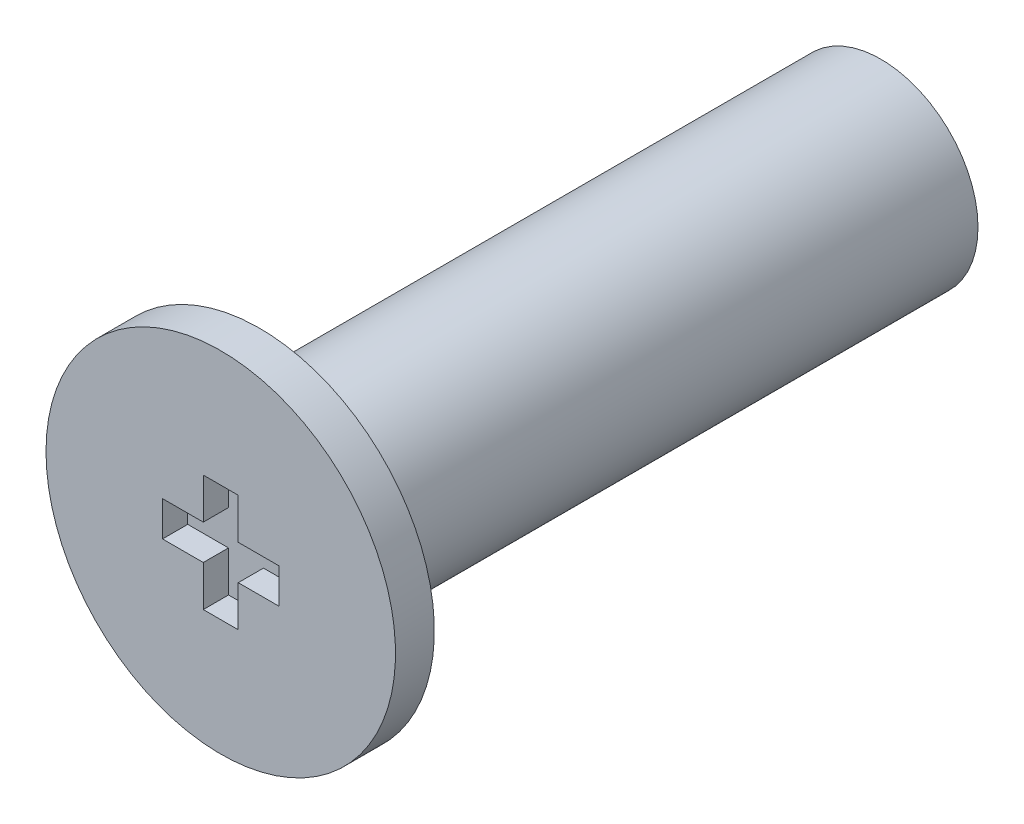
ISO-10303-21;
HEADER;
FILE_DESCRIPTION(('STEP AP214'),'2;1');
FILE_NAME('part.step','',(''),(''),'','','');
FILE_SCHEMA(('AUTOMOTIVE_DESIGN { 1 0 10303 214 1 1 1 1 }'));
ENDSEC;
DATA;
#1=APPLICATION_CONTEXT('core data for automotive mechanical design processes');
#2=APPLICATION_PROTOCOL_DEFINITION('international standard','automotive_design',2000,#1);
#3=PRODUCT_CONTEXT('',#1,'mechanical');
#4=PRODUCT('Part','Part','',(#3));
#5=PRODUCT_RELATED_PRODUCT_CATEGORY('part','',(#4));
#6=PRODUCT_DEFINITION_FORMATION('','',#4);
#7=PRODUCT_DEFINITION_CONTEXT('part definition',#1,'design');
#8=PRODUCT_DEFINITION('design','',#6,#7);
#9=PRODUCT_DEFINITION_SHAPE('','',#8);
#10=(LENGTH_UNIT() NAMED_UNIT(*) SI_UNIT(.MILLI.,.METRE.));
#11=(NAMED_UNIT(*) PLANE_ANGLE_UNIT() SI_UNIT($,.RADIAN.));
#12=(NAMED_UNIT(*) SI_UNIT($,.STERADIAN.) SOLID_ANGLE_UNIT());
#13=UNCERTAINTY_MEASURE_WITH_UNIT(LENGTH_MEASURE(1.E-05),#10,'distance_accuracy_value','');
#14=(GEOMETRIC_REPRESENTATION_CONTEXT(3) GLOBAL_UNCERTAINTY_ASSIGNED_CONTEXT((#13)) GLOBAL_UNIT_ASSIGNED_CONTEXT((#10,
#11,#12)) REPRESENTATION_CONTEXT('',''));
#15=CARTESIAN_POINT('',(0.,0.,0.));
#16=DIRECTION('',(0.,0.,1.));
#17=DIRECTION('',(1.,0.,0.));
#18=AXIS2_PLACEMENT_3D('',#15,#16,#17);
#19=CARTESIAN_POINT('',(0.,0.,-16.));
#20=DIRECTION('',(0.,0.,1.));
#21=DIRECTION('',(1.,0.,0.));
#22=AXIS2_PLACEMENT_3D('',#19,#20,#21);
#23=CYLINDRICAL_SURFACE('',#22,2.5);
#24=CARTESIAN_POINT('',(0.,0.,-16.));
#25=DIRECTION('',(0.,0.,1.));
#26=DIRECTION('',(1.,0.,0.));
#27=AXIS2_PLACEMENT_3D('',#24,#25,#26);
#28=CIRCLE('',#27,2.5);
#29=CARTESIAN_POINT('',(2.5,0.,-16.));
#30=VERTEX_POINT('',#29);
#31=EDGE_CURVE('E212',#30,#30,#28,.T.);
#32=ORIENTED_EDGE('',*,*,#31,.T.);
#33=EDGE_LOOP('',(#32));
#34=FACE_BOUND('',#33,.T.);
#35=CARTESIAN_POINT('',(0.,0.,0.));
#36=DIRECTION('',(0.,0.,1.));
#37=DIRECTION('',(1.,0.,0.));
#38=AXIS2_PLACEMENT_3D('',#35,#36,#37);
#39=CIRCLE('',#38,2.5);
#40=CARTESIAN_POINT('',(2.5,0.,0.));
#41=VERTEX_POINT('',#40);
#42=EDGE_CURVE('E208',#41,#41,#39,.T.);
#43=ORIENTED_EDGE('',*,*,#42,.F.);
#44=EDGE_LOOP('',(#43));
#45=FACE_BOUND('',#44,.T.);
#46=ADVANCED_FACE('F41',(#34,#45),#23,.T.);
#47=CARTESIAN_POINT('',(0.,0.,-16.));
#48=DIRECTION('',(0.,0.,1.));
#49=DIRECTION('',(1.,0.,0.));
#50=AXIS2_PLACEMENT_3D('',#47,#48,#49);
#51=PLANE('',#50);
#52=ORIENTED_EDGE('',*,*,#31,.F.);
#53=EDGE_LOOP('',(#52));
#54=FACE_BOUND('',#53,.T.);
#55=ADVANCED_FACE('F281',(#54),#51,.F.);
#56=CARTESIAN_POINT('',(0.,0.,0.));
#57=DIRECTION('',(0.,0.,1.));
#58=DIRECTION('',(1.,0.,0.));
#59=AXIS2_PLACEMENT_3D('',#56,#57,#58);
#60=PLANE('',#59);
#61=ORIENTED_EDGE('',*,*,#42,.T.);
#62=EDGE_LOOP('',(#61));
#63=FACE_BOUND('',#62,.T.);
#64=CARTESIAN_POINT('',(0.,0.,0.));
#65=DIRECTION('',(0.,0.,-1.));
#66=DIRECTION('',(-1.,0.,0.));
#67=AXIS2_PLACEMENT_3D('',#64,#65,#66);
#68=CIRCLE('',#67,4.5);
#69=CARTESIAN_POINT('',(-4.5,0.,0.));
#70=VERTEX_POINT('',#69);
#71=EDGE_CURVE('E210',#70,#70,#68,.T.);
#72=ORIENTED_EDGE('',*,*,#71,.T.);
#73=EDGE_LOOP('',(#72));
#74=FACE_BOUND('',#73,.T.);
#75=ADVANCED_FACE('F286',(#63,#74),#60,.F.);
#76=CARTESIAN_POINT('',(0.,0.,-2.));
#77=DIRECTION('',(0.,0.,-1.));
#78=DIRECTION('',(-1.,0.,0.));
#79=AXIS2_PLACEMENT_3D('',#76,#77,#78);
#80=CYLINDRICAL_SURFACE('',#79,4.5);
#81=ORIENTED_EDGE('',*,*,#71,.F.);
#82=EDGE_LOOP('',(#81));
#83=FACE_BOUND('',#82,.T.);
#84=CARTESIAN_POINT('',(0.,0.,1.));
#85=DIRECTION('',(0.,0.,-1.));
#86=DIRECTION('',(-1.,0.,0.));
#87=AXIS2_PLACEMENT_3D('',#84,#85,#86);
#88=CIRCLE('',#87,4.5);
#89=CARTESIAN_POINT('',(-4.5,0.,1.));
#90=VERTEX_POINT('',#89);
#91=EDGE_CURVE('E180',#90,#90,#88,.T.);
#92=ORIENTED_EDGE('',*,*,#91,.T.);
#93=EDGE_LOOP('',(#92));
#94=FACE_BOUND('',#93,.T.);
#95=ADVANCED_FACE('F300',(#83,#94),#80,.T.);
#96=CARTESIAN_POINT('',(4.5,0.,1.));
#97=DIRECTION('',(0.,0.,-1.));
#98=DIRECTION('',(-1.,0.,0.));
#99=AXIS2_PLACEMENT_3D('',#96,#97,#98);
#100=PLANE('',#99);
#101=DIRECTION('',(-1.,0.,0.));
#102=VECTOR('',#101,1.);
#103=CARTESIAN_POINT('',(4.5,-1.5,1.));
#104=LINE('',#103,#102);
#105=CARTESIAN_POINT('',(0.45,-1.5,1.));
#106=VERTEX_POINT('',#105);
#107=CARTESIAN_POINT('',(-0.45,-1.5,1.));
#108=VERTEX_POINT('',#107);
#109=EDGE_CURVE('E211',#106,#108,#104,.T.);
#110=ORIENTED_EDGE('',*,*,#109,.T.);
#111=DIRECTION('',(0.,1.,0.));
#112=VECTOR('',#111,1.);
#113=CARTESIAN_POINT('',(-0.45,0.,1.));
#114=LINE('',#113,#112);
#115=CARTESIAN_POINT('',(-0.45,-0.45,1.));
#116=VERTEX_POINT('',#115);
#117=EDGE_CURVE('E11',#108,#116,#114,.T.);
#118=ORIENTED_EDGE('',*,*,#117,.T.);
#119=DIRECTION('',(-1.,0.,0.));
#120=VECTOR('',#119,1.);
#121=CARTESIAN_POINT('',(4.5,-0.45,1.));
#122=LINE('',#121,#120);
#123=CARTESIAN_POINT('',(-1.5,-0.45,1.));
#124=VERTEX_POINT('',#123);
#125=EDGE_CURVE('E48',#116,#124,#122,.T.);
#126=ORIENTED_EDGE('',*,*,#125,.T.);
#127=DIRECTION('',(0.,1.,0.));
#128=VECTOR('',#127,1.);
#129=CARTESIAN_POINT('',(-1.5,0.,1.));
#130=LINE('',#129,#128);
#131=CARTESIAN_POINT('',(-1.5,0.45,1.));
#132=VERTEX_POINT('',#131);
#133=EDGE_CURVE('E245',#124,#132,#130,.T.);
#134=ORIENTED_EDGE('',*,*,#133,.T.);
#135=DIRECTION('',(1.,0.,0.));
#136=VECTOR('',#135,1.);
#137=CARTESIAN_POINT('',(4.5,0.45,1.));
#138=LINE('',#137,#136);
#139=CARTESIAN_POINT('',(-0.45,0.45,1.));
#140=VERTEX_POINT('',#139);
#141=EDGE_CURVE('E236',#132,#140,#138,.T.);
#142=ORIENTED_EDGE('',*,*,#141,.T.);
#143=DIRECTION('',(0.,1.,0.));
#144=VECTOR('',#143,1.);
#145=CARTESIAN_POINT('',(-0.45,0.,1.));
#146=LINE('',#145,#144);
#147=CARTESIAN_POINT('',(-0.45,1.5,1.));
#148=VERTEX_POINT('',#147);
#149=EDGE_CURVE('E237',#140,#148,#146,.T.);
#150=ORIENTED_EDGE('',*,*,#149,.T.);
#151=DIRECTION('',(1.,0.,0.));
#152=VECTOR('',#151,1.);
#153=CARTESIAN_POINT('',(4.5,1.5,1.));
#154=LINE('',#153,#152);
#155=CARTESIAN_POINT('',(0.45,1.5,1.));
#156=VERTEX_POINT('',#155);
#157=EDGE_CURVE('E231',#148,#156,#154,.T.);
#158=ORIENTED_EDGE('',*,*,#157,.T.);
#159=DIRECTION('',(0.,-1.,0.));
#160=VECTOR('',#159,1.);
#161=CARTESIAN_POINT('',(0.45,0.,1.));
#162=LINE('',#161,#160);
#163=CARTESIAN_POINT('',(0.45,0.45,1.));
#164=VERTEX_POINT('',#163);
#165=EDGE_CURVE('E229',#156,#164,#162,.T.);
#166=ORIENTED_EDGE('',*,*,#165,.T.);
#167=DIRECTION('',(1.,0.,0.));
#168=VECTOR('',#167,1.);
#169=CARTESIAN_POINT('',(4.5,0.45,1.));
#170=LINE('',#169,#168);
#171=CARTESIAN_POINT('',(1.5,0.45,1.));
#172=VERTEX_POINT('',#171);
#173=EDGE_CURVE('E230',#164,#172,#170,.T.);
#174=ORIENTED_EDGE('',*,*,#173,.T.);
#175=DIRECTION('',(0.,-1.,0.));
#176=VECTOR('',#175,1.);
#177=CARTESIAN_POINT('',(1.5,0.,1.));
#178=LINE('',#177,#176);
#179=CARTESIAN_POINT('',(1.5,-0.45,1.));
#180=VERTEX_POINT('',#179);
#181=EDGE_CURVE('E224',#172,#180,#178,.T.);
#182=ORIENTED_EDGE('',*,*,#181,.T.);
#183=DIRECTION('',(-1.,0.,0.));
#184=VECTOR('',#183,1.);
#185=CARTESIAN_POINT('',(4.5,-0.45,1.));
#186=LINE('',#185,#184);
#187=CARTESIAN_POINT('',(0.45,-0.45,1.));
#188=VERTEX_POINT('',#187);
#189=EDGE_CURVE('E222',#180,#188,#186,.T.);
#190=ORIENTED_EDGE('',*,*,#189,.T.);
#191=DIRECTION('',(0.,-1.,0.));
#192=VECTOR('',#191,1.);
#193=CARTESIAN_POINT('',(0.45,0.,1.));
#194=LINE('',#193,#192);
#195=EDGE_CURVE('E217',#188,#106,#194,.T.);
#196=ORIENTED_EDGE('',*,*,#195,.T.);
#197=EDGE_LOOP('',(#110,#118,#126,#134,#142,#150,#158,#166,#174,#182,#190,#196));
#198=FACE_BOUND('',#197,.T.);
#199=ORIENTED_EDGE('',*,*,#91,.F.);
#200=EDGE_LOOP('',(#199));
#201=FACE_BOUND('',#200,.T.);
#202=ADVANCED_FACE('F244',(#198,#201),#100,.F.);
#203=CARTESIAN_POINT('',(-0.45,-0.45,0.35));
#204=DIRECTION('',(-1.,0.,0.));
#205=DIRECTION('',(0.,0.,1.));
#206=AXIS2_PLACEMENT_3D('',#203,#204,#205);
#207=PLANE('',#206);
#208=DIRECTION('',(0.,0.,1.));
#209=VECTOR('',#208,1.);
#210=CARTESIAN_POINT('',(-0.45,-1.5,0.35));
#211=LINE('',#210,#209);
#212=CARTESIAN_POINT('',(-0.45,-1.5,0.35));
#213=VERTEX_POINT('',#212);
#214=EDGE_CURVE('E54',#213,#108,#211,.T.);
#215=ORIENTED_EDGE('',*,*,#214,.F.);
#216=DIRECTION('',(0.,-1.,0.));
#217=VECTOR('',#216,1.);
#218=CARTESIAN_POINT('',(-0.45,-0.45,0.35));
#219=LINE('',#218,#217);
#220=CARTESIAN_POINT('',(-0.45,-0.45,0.35));
#221=VERTEX_POINT('',#220);
#222=EDGE_CURVE('E129',#221,#213,#219,.T.);
#223=ORIENTED_EDGE('',*,*,#222,.F.);
#224=DIRECTION('',(0.,0.,1.));
#225=VECTOR('',#224,1.);
#226=CARTESIAN_POINT('',(-0.45,-0.45,0.35));
#227=LINE('',#226,#225);
#228=EDGE_CURVE('E171',#221,#116,#227,.T.);
#229=ORIENTED_EDGE('',*,*,#228,.T.);
#230=ORIENTED_EDGE('',*,*,#117,.F.);
#231=EDGE_LOOP('',(#215,#223,#229,#230));
#232=FACE_BOUND('',#231,.T.);
#233=ADVANCED_FACE('F127',(#232),#207,.F.);
#234=CARTESIAN_POINT('',(-1.5,-0.45,0.35));
#235=DIRECTION('',(0.,-1.,0.));
#236=DIRECTION('',(0.,0.,-1.));
#237=AXIS2_PLACEMENT_3D('',#234,#235,#236);
#238=PLANE('',#237);
#239=ORIENTED_EDGE('',*,*,#228,.F.);
#240=DIRECTION('',(1.,0.,0.));
#241=VECTOR('',#240,1.);
#242=CARTESIAN_POINT('',(-1.5,-0.45,0.35));
#243=LINE('',#242,#241);
#244=CARTESIAN_POINT('',(-1.5,-0.45,0.35));
#245=VERTEX_POINT('',#244);
#246=EDGE_CURVE('E131',#245,#221,#243,.T.);
#247=ORIENTED_EDGE('',*,*,#246,.F.);
#248=DIRECTION('',(0.,0.,1.));
#249=VECTOR('',#248,1.);
#250=CARTESIAN_POINT('',(-1.5,-0.45,0.35));
#251=LINE('',#250,#249);
#252=EDGE_CURVE('E177',#245,#124,#251,.T.);
#253=ORIENTED_EDGE('',*,*,#252,.T.);
#254=ORIENTED_EDGE('',*,*,#125,.F.);
#255=EDGE_LOOP('',(#239,#247,#253,#254));
#256=FACE_BOUND('',#255,.T.);
#257=ADVANCED_FACE('F273',(#256),#238,.F.);
#258=CARTESIAN_POINT('',(-1.5,0.45,0.35));
#259=DIRECTION('',(-1.,0.,0.));
#260=DIRECTION('',(0.,0.,1.));
#261=AXIS2_PLACEMENT_3D('',#258,#259,#260);
#262=PLANE('',#261);
#263=ORIENTED_EDGE('',*,*,#252,.F.);
#264=DIRECTION('',(0.,-1.,0.));
#265=VECTOR('',#264,1.);
#266=CARTESIAN_POINT('',(-1.5,0.45,0.35));
#267=LINE('',#266,#265);
#268=CARTESIAN_POINT('',(-1.5,0.45,0.35));
#269=VERTEX_POINT('',#268);
#270=EDGE_CURVE('E175',#269,#245,#267,.T.);
#271=ORIENTED_EDGE('',*,*,#270,.F.);
#272=DIRECTION('',(0.,0.,1.));
#273=VECTOR('',#272,1.);
#274=CARTESIAN_POINT('',(-1.5,0.45,0.35));
#275=LINE('',#274,#273);
#276=EDGE_CURVE('E179',#269,#132,#275,.T.);
#277=ORIENTED_EDGE('',*,*,#276,.T.);
#278=ORIENTED_EDGE('',*,*,#133,.F.);
#279=EDGE_LOOP('',(#263,#271,#277,#278));
#280=FACE_BOUND('',#279,.T.);
#281=ADVANCED_FACE('F275',(#280),#262,.F.);
#282=CARTESIAN_POINT('',(-0.45,0.45,0.35));
#283=DIRECTION('',(0.,1.,0.));
#284=DIRECTION('',(0.,0.,1.));
#285=AXIS2_PLACEMENT_3D('',#282,#283,#284);
#286=PLANE('',#285);
#287=ORIENTED_EDGE('',*,*,#276,.F.);
#288=DIRECTION('',(-1.,0.,0.));
#289=VECTOR('',#288,1.);
#290=CARTESIAN_POINT('',(-0.45,0.45,0.35));
#291=LINE('',#290,#289);
#292=CARTESIAN_POINT('',(-0.45,0.45,0.35));
#293=VERTEX_POINT('',#292);
#294=EDGE_CURVE('E168',#293,#269,#291,.T.);
#295=ORIENTED_EDGE('',*,*,#294,.F.);
#296=DIRECTION('',(0.,0.,1.));
#297=VECTOR('',#296,1.);
#298=CARTESIAN_POINT('',(-0.45,0.45,0.35));
#299=LINE('',#298,#297);
#300=EDGE_CURVE('E181',#293,#140,#299,.T.);
#301=ORIENTED_EDGE('',*,*,#300,.T.);
#302=ORIENTED_EDGE('',*,*,#141,.F.);
#303=EDGE_LOOP('',(#287,#295,#301,#302));
#304=FACE_BOUND('',#303,.T.);
#305=ADVANCED_FACE('F269',(#304),#286,.F.);
#306=CARTESIAN_POINT('',(-0.45,1.5,0.35));
#307=DIRECTION('',(-1.,0.,0.));
#308=DIRECTION('',(0.,0.,1.));
#309=AXIS2_PLACEMENT_3D('',#306,#307,#308);
#310=PLANE('',#309);
#311=ORIENTED_EDGE('',*,*,#300,.F.);
#312=DIRECTION('',(0.,-1.,0.));
#313=VECTOR('',#312,1.);
#314=CARTESIAN_POINT('',(-0.45,1.5,0.35));
#315=LINE('',#314,#313);
#316=CARTESIAN_POINT('',(-0.45,1.5,0.35));
#317=VERTEX_POINT('',#316);
#318=EDGE_CURVE('E166',#317,#293,#315,.T.);
#319=ORIENTED_EDGE('',*,*,#318,.F.);
#320=DIRECTION('',(0.,0.,1.));
#321=VECTOR('',#320,1.);
#322=CARTESIAN_POINT('',(-0.45,1.5,0.35));
#323=LINE('',#322,#321);
#324=EDGE_CURVE('E188',#317,#148,#323,.T.);
#325=ORIENTED_EDGE('',*,*,#324,.T.);
#326=ORIENTED_EDGE('',*,*,#149,.F.);
#327=EDGE_LOOP('',(#311,#319,#325,#326));
#328=FACE_BOUND('',#327,.T.);
#329=ADVANCED_FACE('F266',(#328),#310,.F.);
#330=CARTESIAN_POINT('',(0.45,1.5,0.35));
#331=DIRECTION('',(0.,1.,0.));
#332=DIRECTION('',(0.,0.,1.));
#333=AXIS2_PLACEMENT_3D('',#330,#331,#332);
#334=PLANE('',#333);
#335=ORIENTED_EDGE('',*,*,#324,.F.);
#336=DIRECTION('',(-1.,0.,0.));
#337=VECTOR('',#336,1.);
#338=CARTESIAN_POINT('',(0.45,1.5,0.35));
#339=LINE('',#338,#337);
#340=CARTESIAN_POINT('',(0.45,1.5,0.35));
#341=VERTEX_POINT('',#340);
#342=EDGE_CURVE('E164',#341,#317,#339,.T.);
#343=ORIENTED_EDGE('',*,*,#342,.F.);
#344=DIRECTION('',(0.,0.,1.));
#345=VECTOR('',#344,1.);
#346=CARTESIAN_POINT('',(0.45,1.5,0.35));
#347=LINE('',#346,#345);
#348=EDGE_CURVE('E189',#341,#156,#347,.T.);
#349=ORIENTED_EDGE('',*,*,#348,.T.);
#350=ORIENTED_EDGE('',*,*,#157,.F.);
#351=EDGE_LOOP('',(#335,#343,#349,#350));
#352=FACE_BOUND('',#351,.T.);
#353=ADVANCED_FACE('F261',(#352),#334,.F.);
#354=CARTESIAN_POINT('',(0.45,0.45,0.35));
#355=DIRECTION('',(1.,0.,0.));
#356=DIRECTION('',(0.,0.,-1.));
#357=AXIS2_PLACEMENT_3D('',#354,#355,#356);
#358=PLANE('',#357);
#359=ORIENTED_EDGE('',*,*,#348,.F.);
#360=DIRECTION('',(0.,1.,0.));
#361=VECTOR('',#360,1.);
#362=CARTESIAN_POINT('',(0.45,0.45,0.35));
#363=LINE('',#362,#361);
#364=CARTESIAN_POINT('',(0.45,0.45,0.35));
#365=VERTEX_POINT('',#364);
#366=EDGE_CURVE('E158',#365,#341,#363,.T.);
#367=ORIENTED_EDGE('',*,*,#366,.F.);
#368=DIRECTION('',(0.,0.,1.));
#369=VECTOR('',#368,1.);
#370=CARTESIAN_POINT('',(0.45,0.45,0.35));
#371=LINE('',#370,#369);
#372=EDGE_CURVE('E195',#365,#164,#371,.T.);
#373=ORIENTED_EDGE('',*,*,#372,.T.);
#374=ORIENTED_EDGE('',*,*,#165,.F.);
#375=EDGE_LOOP('',(#359,#367,#373,#374));
#376=FACE_BOUND('',#375,.T.);
#377=ADVANCED_FACE('F263',(#376),#358,.F.);
#378=CARTESIAN_POINT('',(1.5,0.45,0.35));
#379=DIRECTION('',(0.,1.,0.));
#380=DIRECTION('',(0.,0.,1.));
#381=AXIS2_PLACEMENT_3D('',#378,#379,#380);
#382=PLANE('',#381);
#383=ORIENTED_EDGE('',*,*,#372,.F.);
#384=DIRECTION('',(-1.,0.,0.));
#385=VECTOR('',#384,1.);
#386=CARTESIAN_POINT('',(1.5,0.45,0.35));
#387=LINE('',#386,#385);
#388=CARTESIAN_POINT('',(1.5,0.45,0.35));
#389=VERTEX_POINT('',#388);
#390=EDGE_CURVE('E160',#389,#365,#387,.T.);
#391=ORIENTED_EDGE('',*,*,#390,.F.);
#392=DIRECTION('',(0.,0.,1.));
#393=VECTOR('',#392,1.);
#394=CARTESIAN_POINT('',(1.5,0.45,0.35));
#395=LINE('',#394,#393);
#396=EDGE_CURVE('E194',#389,#172,#395,.T.);
#397=ORIENTED_EDGE('',*,*,#396,.T.);
#398=ORIENTED_EDGE('',*,*,#173,.F.);
#399=EDGE_LOOP('',(#383,#391,#397,#398));
#400=FACE_BOUND('',#399,.T.);
#401=ADVANCED_FACE('F257',(#400),#382,.F.);
#402=CARTESIAN_POINT('',(1.5,-0.45,0.35));
#403=DIRECTION('',(1.,0.,0.));
#404=DIRECTION('',(0.,0.,-1.));
#405=AXIS2_PLACEMENT_3D('',#402,#403,#404);
#406=PLANE('',#405);
#407=ORIENTED_EDGE('',*,*,#396,.F.);
#408=DIRECTION('',(0.,1.,0.));
#409=VECTOR('',#408,1.);
#410=CARTESIAN_POINT('',(1.5,-0.45,0.35));
#411=LINE('',#410,#409);
#412=CARTESIAN_POINT('',(1.5,-0.45,0.35));
#413=VERTEX_POINT('',#412);
#414=EDGE_CURVE('E153',#413,#389,#411,.T.);
#415=ORIENTED_EDGE('',*,*,#414,.F.);
#416=DIRECTION('',(0.,0.,1.));
#417=VECTOR('',#416,1.);
#418=CARTESIAN_POINT('',(1.5,-0.45,0.35));
#419=LINE('',#418,#417);
#420=EDGE_CURVE('E198',#413,#180,#419,.T.);
#421=ORIENTED_EDGE('',*,*,#420,.T.);
#422=ORIENTED_EDGE('',*,*,#181,.F.);
#423=EDGE_LOOP('',(#407,#415,#421,#422));
#424=FACE_BOUND('',#423,.T.);
#425=ADVANCED_FACE('F253',(#424),#406,.F.);
#426=CARTESIAN_POINT('',(0.45,-0.45,0.35));
#427=DIRECTION('',(0.,-1.,0.));
#428=DIRECTION('',(0.,0.,-1.));
#429=AXIS2_PLACEMENT_3D('',#426,#427,#428);
#430=PLANE('',#429);
#431=ORIENTED_EDGE('',*,*,#420,.F.);
#432=DIRECTION('',(1.,0.,0.));
#433=VECTOR('',#432,1.);
#434=CARTESIAN_POINT('',(0.45,-0.45,0.35));
#435=LINE('',#434,#433);
#436=CARTESIAN_POINT('',(0.45,-0.45,0.35));
#437=VERTEX_POINT('',#436);
#438=EDGE_CURVE('E151',#437,#413,#435,.T.);
#439=ORIENTED_EDGE('',*,*,#438,.F.);
#440=DIRECTION('',(0.,0.,1.));
#441=VECTOR('',#440,1.);
#442=CARTESIAN_POINT('',(0.45,-0.45,0.35));
#443=LINE('',#442,#441);
#444=EDGE_CURVE('E201',#437,#188,#443,.T.);
#445=ORIENTED_EDGE('',*,*,#444,.T.);
#446=ORIENTED_EDGE('',*,*,#189,.F.);
#447=EDGE_LOOP('',(#431,#439,#445,#446));
#448=FACE_BOUND('',#447,.T.);
#449=ADVANCED_FACE('F255',(#448),#430,.F.);
#450=CARTESIAN_POINT('',(0.45,-1.5,0.35));
#451=DIRECTION('',(1.,0.,0.));
#452=DIRECTION('',(0.,0.,-1.));
#453=AXIS2_PLACEMENT_3D('',#450,#451,#452);
#454=PLANE('',#453);
#455=ORIENTED_EDGE('',*,*,#444,.F.);
#456=DIRECTION('',(0.,1.,0.));
#457=VECTOR('',#456,1.);
#458=CARTESIAN_POINT('',(0.45,-1.5,0.35));
#459=LINE('',#458,#457);
#460=CARTESIAN_POINT('',(0.45,-1.5,0.35));
#461=VERTEX_POINT('',#460);
#462=EDGE_CURVE('E142',#461,#437,#459,.T.);
#463=ORIENTED_EDGE('',*,*,#462,.F.);
#464=DIRECTION('',(0.,0.,1.));
#465=VECTOR('',#464,1.);
#466=CARTESIAN_POINT('',(0.45,-1.5,0.35));
#467=LINE('',#466,#465);
#468=EDGE_CURVE('E134',#461,#106,#467,.T.);
#469=ORIENTED_EDGE('',*,*,#468,.T.);
#470=ORIENTED_EDGE('',*,*,#195,.F.);
#471=EDGE_LOOP('',(#455,#463,#469,#470));
#472=FACE_BOUND('',#471,.T.);
#473=ADVANCED_FACE('F248',(#472),#454,.F.);
#474=CARTESIAN_POINT('',(-0.45,-1.5,0.35));
#475=DIRECTION('',(0.,-1.,0.));
#476=DIRECTION('',(0.,0.,-1.));
#477=AXIS2_PLACEMENT_3D('',#474,#475,#476);
#478=PLANE('',#477);
#479=ORIENTED_EDGE('',*,*,#468,.F.);
#480=DIRECTION('',(1.,0.,0.));
#481=VECTOR('',#480,1.);
#482=CARTESIAN_POINT('',(-0.45,-1.5,0.35));
#483=LINE('',#482,#481);
#484=EDGE_CURVE('E140',#213,#461,#483,.T.);
#485=ORIENTED_EDGE('',*,*,#484,.F.);
#486=ORIENTED_EDGE('',*,*,#214,.T.);
#487=ORIENTED_EDGE('',*,*,#109,.F.);
#488=EDGE_LOOP('',(#479,#485,#486,#487));
#489=FACE_BOUND('',#488,.T.);
#490=ADVANCED_FACE('F139',(#489),#478,.F.);
#491=CARTESIAN_POINT('',(0.,0.,0.35));
#492=DIRECTION('',(0.,0.,1.));
#493=DIRECTION('',(1.,0.,0.));
#494=AXIS2_PLACEMENT_3D('',#491,#492,#493);
#495=PLANE('',#494);
#496=ORIENTED_EDGE('',*,*,#222,.T.);
#497=ORIENTED_EDGE('',*,*,#484,.T.);
#498=ORIENTED_EDGE('',*,*,#462,.T.);
#499=ORIENTED_EDGE('',*,*,#438,.T.);
#500=ORIENTED_EDGE('',*,*,#414,.T.);
#501=ORIENTED_EDGE('',*,*,#390,.T.);
#502=ORIENTED_EDGE('',*,*,#366,.T.);
#503=ORIENTED_EDGE('',*,*,#342,.T.);
#504=ORIENTED_EDGE('',*,*,#318,.T.);
#505=ORIENTED_EDGE('',*,*,#294,.T.);
#506=ORIENTED_EDGE('',*,*,#270,.T.);
#507=ORIENTED_EDGE('',*,*,#246,.T.);
#508=EDGE_LOOP('',(#496,#497,#498,#499,#500,#501,#502,#503,#504,#505,#506,#507));
#509=FACE_BOUND('',#508,.T.);
#510=ADVANCED_FACE('F144',(#509),#495,.T.);
#511=CLOSED_SHELL('',(#46,#55,#75,#95,#202,#233,#257,#281,#305,#329,#353,#377,#401,#425,#449,
#473,#490,#510));
#512=MANIFOLD_SOLID_BREP('B2',#511);
#513=ADVANCED_BREP_SHAPE_REPRESENTATION('',(#18,#512),#14);
#514=SHAPE_DEFINITION_REPRESENTATION(#9,#513);
ENDSEC;
END-ISO-10303-21;
